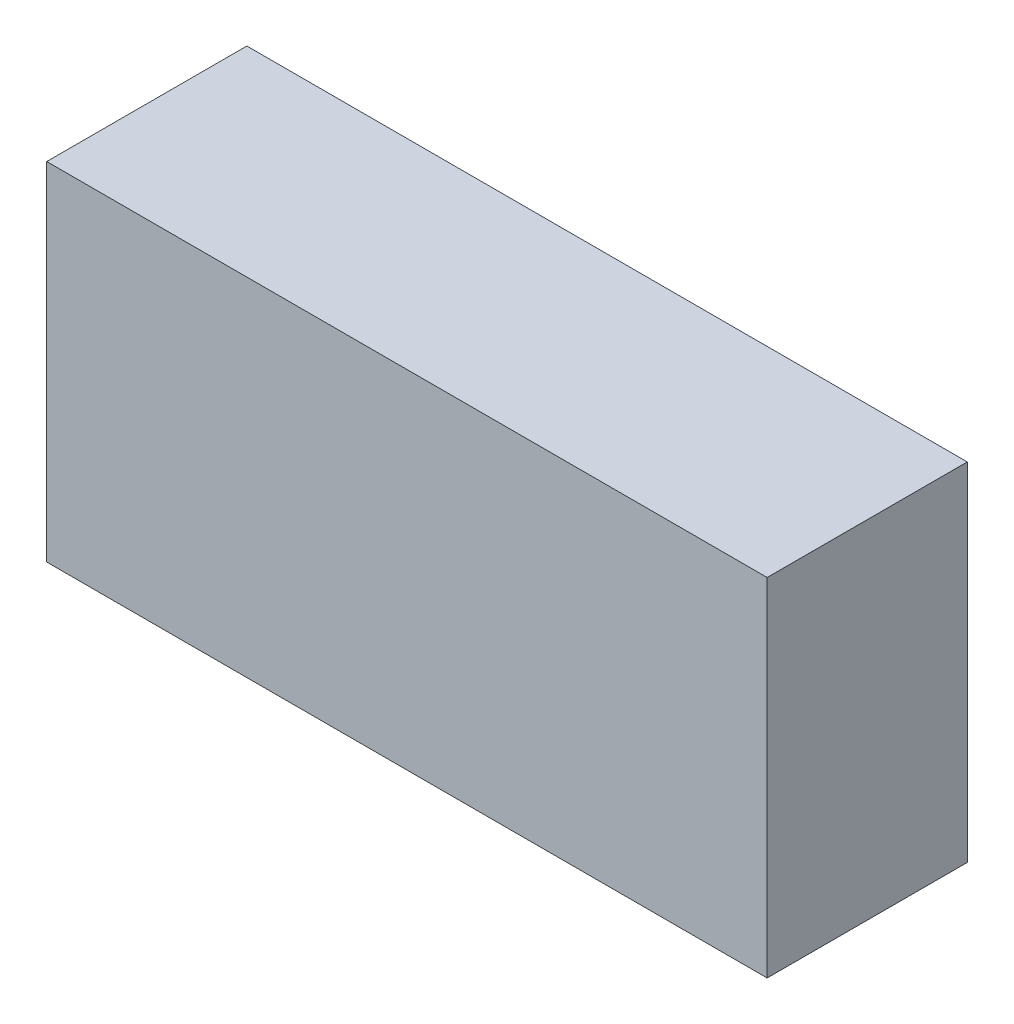
ISO-10303-21;
HEADER;
FILE_DESCRIPTION(('STEP AP214'),'2;1');
FILE_NAME('part.step','',(''),(''),'','','');
FILE_SCHEMA(('AUTOMOTIVE_DESIGN { 1 0 10303 214 1 1 1 1 }'));
ENDSEC;
DATA;
#1=APPLICATION_CONTEXT('core data for automotive mechanical design processes');
#2=APPLICATION_PROTOCOL_DEFINITION('international standard','automotive_design',2000,#1);
#3=PRODUCT_CONTEXT('',#1,'mechanical');
#4=PRODUCT('Part','Part','',(#3));
#5=PRODUCT_RELATED_PRODUCT_CATEGORY('part','',(#4));
#6=PRODUCT_DEFINITION_FORMATION('','',#4);
#7=PRODUCT_DEFINITION_CONTEXT('part definition',#1,'design');
#8=PRODUCT_DEFINITION('design','',#6,#7);
#9=PRODUCT_DEFINITION_SHAPE('','',#8);
#10=(LENGTH_UNIT() NAMED_UNIT(*) SI_UNIT(.MILLI.,.METRE.));
#11=(NAMED_UNIT(*) PLANE_ANGLE_UNIT() SI_UNIT($,.RADIAN.));
#12=(NAMED_UNIT(*) SI_UNIT($,.STERADIAN.) SOLID_ANGLE_UNIT());
#13=UNCERTAINTY_MEASURE_WITH_UNIT(LENGTH_MEASURE(1.E-05),#10,'distance_accuracy_value','');
#14=(GEOMETRIC_REPRESENTATION_CONTEXT(3) GLOBAL_UNCERTAINTY_ASSIGNED_CONTEXT((#13)) GLOBAL_UNIT_ASSIGNED_CONTEXT((#10,
#11,#12)) REPRESENTATION_CONTEXT('',''));
#15=CARTESIAN_POINT('',(0.,0.,0.));
#16=DIRECTION('',(0.,0.,1.));
#17=DIRECTION('',(1.,0.,0.));
#18=AXIS2_PLACEMENT_3D('',#15,#16,#17);
#19=CARTESIAN_POINT('',(-27.,13.,15.));
#20=DIRECTION('',(1.,0.,0.));
#21=DIRECTION('',(0.,0.,-1.));
#22=AXIS2_PLACEMENT_3D('',#19,#20,#21);
#23=PLANE('',#22);
#24=DIRECTION('',(0.,-1.,0.));
#25=VECTOR('',#24,1.);
#26=CARTESIAN_POINT('',(-27.,13.,0.));
#27=LINE('',#26,#25);
#28=CARTESIAN_POINT('',(-27.,13.,0.));
#29=VERTEX_POINT('',#28);
#30=CARTESIAN_POINT('',(-27.,-13.,0.));
#31=VERTEX_POINT('',#30);
#32=EDGE_CURVE('E102',#29,#31,#27,.T.);
#33=ORIENTED_EDGE('',*,*,#32,.T.);
#34=DIRECTION('',(0.,0.,-1.));
#35=VECTOR('',#34,1.);
#36=CARTESIAN_POINT('',(-27.,-13.,15.));
#37=LINE('',#36,#35);
#38=CARTESIAN_POINT('',(-27.,-13.,15.));
#39=VERTEX_POINT('',#38);
#40=EDGE_CURVE('E11',#39,#31,#37,.T.);
#41=ORIENTED_EDGE('',*,*,#40,.F.);
#42=DIRECTION('',(0.,-1.,0.));
#43=VECTOR('',#42,1.);
#44=CARTESIAN_POINT('',(-27.,13.,15.));
#45=LINE('',#44,#43);
#46=CARTESIAN_POINT('',(-27.,13.,15.));
#47=VERTEX_POINT('',#46);
#48=EDGE_CURVE('E90',#47,#39,#45,.T.);
#49=ORIENTED_EDGE('',*,*,#48,.F.);
#50=DIRECTION('',(0.,0.,-1.));
#51=VECTOR('',#50,1.);
#52=CARTESIAN_POINT('',(-27.,13.,15.));
#53=LINE('',#52,#51);
#54=EDGE_CURVE('E98',#47,#29,#53,.T.);
#55=ORIENTED_EDGE('',*,*,#54,.T.);
#56=EDGE_LOOP('',(#33,#41,#49,#55));
#57=FACE_BOUND('',#56,.T.);
#58=ADVANCED_FACE('F39',(#57),#23,.F.);
#59=CARTESIAN_POINT('',(-27.,-13.,15.));
#60=DIRECTION('',(0.,1.,0.));
#61=DIRECTION('',(0.,0.,1.));
#62=AXIS2_PLACEMENT_3D('',#59,#60,#61);
#63=PLANE('',#62);
#64=DIRECTION('',(1.,0.,0.));
#65=VECTOR('',#64,1.);
#66=CARTESIAN_POINT('',(-27.,-13.,0.));
#67=LINE('',#66,#65);
#68=CARTESIAN_POINT('',(27.,-13.,0.));
#69=VERTEX_POINT('',#68);
#70=EDGE_CURVE('E94',#31,#69,#67,.T.);
#71=ORIENTED_EDGE('',*,*,#70,.T.);
#72=DIRECTION('',(0.,0.,-1.));
#73=VECTOR('',#72,1.);
#74=CARTESIAN_POINT('',(27.,-13.,15.));
#75=LINE('',#74,#73);
#76=CARTESIAN_POINT('',(27.,-13.,15.));
#77=VERTEX_POINT('',#76);
#78=EDGE_CURVE('E47',#77,#69,#75,.T.);
#79=ORIENTED_EDGE('',*,*,#78,.F.);
#80=DIRECTION('',(1.,0.,0.));
#81=VECTOR('',#80,1.);
#82=CARTESIAN_POINT('',(-27.,-13.,15.));
#83=LINE('',#82,#81);
#84=EDGE_CURVE('E85',#39,#77,#83,.T.);
#85=ORIENTED_EDGE('',*,*,#84,.F.);
#86=ORIENTED_EDGE('',*,*,#40,.T.);
#87=EDGE_LOOP('',(#71,#79,#85,#86));
#88=FACE_BOUND('',#87,.T.);
#89=ADVANCED_FACE('F93',(#88),#63,.F.);
#90=CARTESIAN_POINT('',(27.,-13.,15.));
#91=DIRECTION('',(-1.,0.,0.));
#92=DIRECTION('',(0.,0.,1.));
#93=AXIS2_PLACEMENT_3D('',#90,#91,#92);
#94=PLANE('',#93);
#95=DIRECTION('',(0.,1.,0.));
#96=VECTOR('',#95,1.);
#97=CARTESIAN_POINT('',(27.,-13.,0.));
#98=LINE('',#97,#96);
#99=CARTESIAN_POINT('',(27.,13.,0.));
#100=VERTEX_POINT('',#99);
#101=EDGE_CURVE('E72',#69,#100,#98,.T.);
#102=ORIENTED_EDGE('',*,*,#101,.T.);
#103=DIRECTION('',(0.,0.,-1.));
#104=VECTOR('',#103,1.);
#105=CARTESIAN_POINT('',(27.,13.,15.));
#106=LINE('',#105,#104);
#107=CARTESIAN_POINT('',(27.,13.,15.));
#108=VERTEX_POINT('',#107);
#109=EDGE_CURVE('E95',#108,#100,#106,.T.);
#110=ORIENTED_EDGE('',*,*,#109,.F.);
#111=DIRECTION('',(0.,1.,0.));
#112=VECTOR('',#111,1.);
#113=CARTESIAN_POINT('',(27.,-13.,15.));
#114=LINE('',#113,#112);
#115=EDGE_CURVE('E88',#77,#108,#114,.T.);
#116=ORIENTED_EDGE('',*,*,#115,.F.);
#117=ORIENTED_EDGE('',*,*,#78,.T.);
#118=EDGE_LOOP('',(#102,#110,#116,#117));
#119=FACE_BOUND('',#118,.T.);
#120=ADVANCED_FACE('F96',(#119),#94,.F.);
#121=CARTESIAN_POINT('',(27.,13.,15.));
#122=DIRECTION('',(0.,-1.,0.));
#123=DIRECTION('',(0.,0.,-1.));
#124=AXIS2_PLACEMENT_3D('',#121,#122,#123);
#125=PLANE('',#124);
#126=DIRECTION('',(-1.,0.,0.));
#127=VECTOR('',#126,1.);
#128=CARTESIAN_POINT('',(27.,13.,0.));
#129=LINE('',#128,#127);
#130=EDGE_CURVE('E78',#100,#29,#129,.T.);
#131=ORIENTED_EDGE('',*,*,#130,.T.);
#132=ORIENTED_EDGE('',*,*,#54,.F.);
#133=DIRECTION('',(-1.,0.,0.));
#134=VECTOR('',#133,1.);
#135=CARTESIAN_POINT('',(27.,13.,15.));
#136=LINE('',#135,#134);
#137=EDGE_CURVE('E55',#108,#47,#136,.T.);
#138=ORIENTED_EDGE('',*,*,#137,.F.);
#139=ORIENTED_EDGE('',*,*,#109,.T.);
#140=EDGE_LOOP('',(#131,#132,#138,#139));
#141=FACE_BOUND('',#140,.T.);
#142=ADVANCED_FACE('F109',(#141),#125,.F.);
#143=CARTESIAN_POINT('',(0.,0.,15.));
#144=DIRECTION('',(0.,0.,1.));
#145=DIRECTION('',(1.,0.,0.));
#146=AXIS2_PLACEMENT_3D('',#143,#144,#145);
#147=PLANE('',#146);
#148=ORIENTED_EDGE('',*,*,#48,.T.);
#149=ORIENTED_EDGE('',*,*,#84,.T.);
#150=ORIENTED_EDGE('',*,*,#115,.T.);
#151=ORIENTED_EDGE('',*,*,#137,.T.);
#152=EDGE_LOOP('',(#148,#149,#150,#151));
#153=FACE_BOUND('',#152,.T.);
#154=ADVANCED_FACE('F86',(#153),#147,.T.);
#155=CARTESIAN_POINT('',(0.,0.,0.));
#156=DIRECTION('',(0.,0.,1.));
#157=DIRECTION('',(1.,0.,0.));
#158=AXIS2_PLACEMENT_3D('',#155,#156,#157);
#159=PLANE('',#158);
#160=ORIENTED_EDGE('',*,*,#32,.F.);
#161=ORIENTED_EDGE('',*,*,#130,.F.);
#162=ORIENTED_EDGE('',*,*,#101,.F.);
#163=ORIENTED_EDGE('',*,*,#70,.F.);
#164=EDGE_LOOP('',(#160,#161,#162,#163));
#165=FACE_BOUND('',#164,.T.);
#166=ADVANCED_FACE('F112',(#165),#159,.F.);
#167=CLOSED_SHELL('',(#58,#89,#120,#142,#154,#166));
#168=MANIFOLD_SOLID_BREP('B2',#167);
#169=ADVANCED_BREP_SHAPE_REPRESENTATION('',(#18,#168),#14);
#170=SHAPE_DEFINITION_REPRESENTATION(#9,#169);
ENDSEC;
END-ISO-10303-21;
